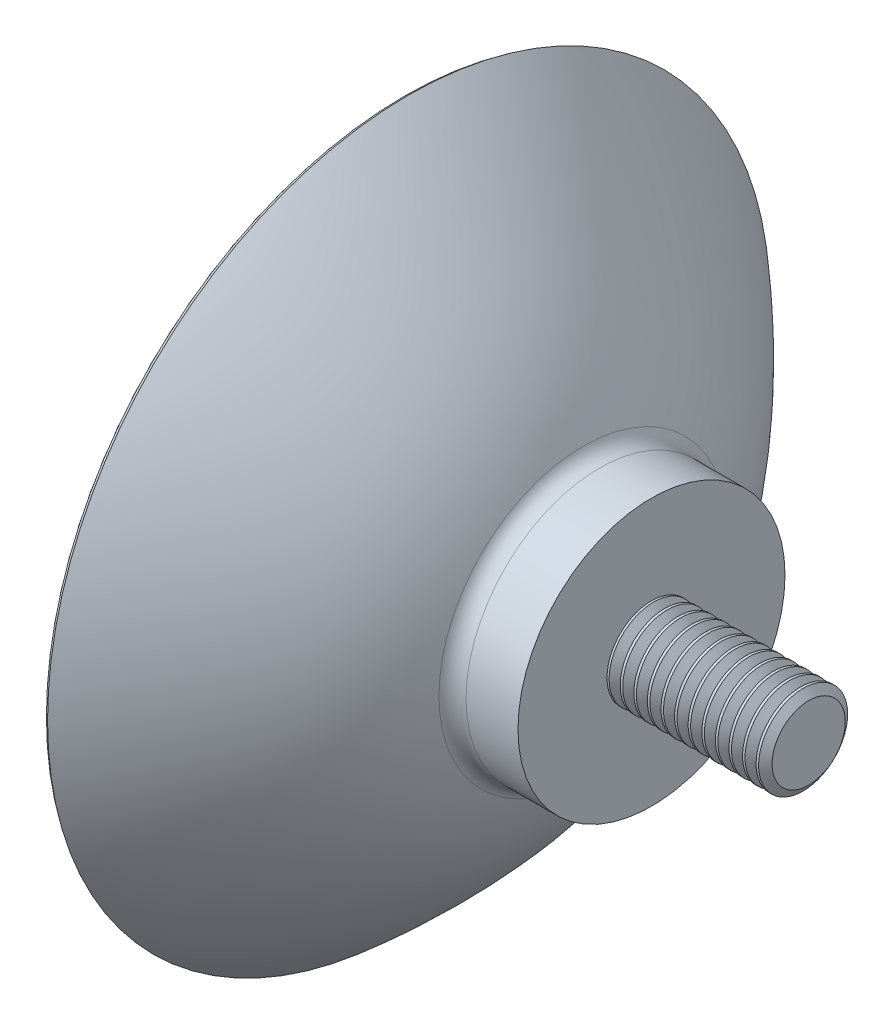
ISO-10303-21;
HEADER;
FILE_DESCRIPTION(('STEP AP214'),'2;1');
FILE_NAME('part.step','',(''),(''),'','','');
FILE_SCHEMA(('AUTOMOTIVE_DESIGN { 1 0 10303 214 1 1 1 1 }'));
ENDSEC;
DATA;
#1=APPLICATION_CONTEXT('core data for automotive mechanical design processes');
#2=APPLICATION_PROTOCOL_DEFINITION('international standard','automotive_design',2000,#1);
#3=PRODUCT_CONTEXT('',#1,'mechanical');
#4=PRODUCT('Part','Part','',(#3));
#5=PRODUCT_RELATED_PRODUCT_CATEGORY('part','',(#4));
#6=PRODUCT_DEFINITION_FORMATION('','',#4);
#7=PRODUCT_DEFINITION_CONTEXT('part definition',#1,'design');
#8=PRODUCT_DEFINITION('design','',#6,#7);
#9=PRODUCT_DEFINITION_SHAPE('','',#8);
#10=(LENGTH_UNIT() NAMED_UNIT(*) SI_UNIT(.MILLI.,.METRE.));
#11=(NAMED_UNIT(*) PLANE_ANGLE_UNIT() SI_UNIT($,.RADIAN.));
#12=(NAMED_UNIT(*) SI_UNIT($,.STERADIAN.) SOLID_ANGLE_UNIT());
#13=UNCERTAINTY_MEASURE_WITH_UNIT(LENGTH_MEASURE(1.E-05),#10,'distance_accuracy_value','');
#14=(GEOMETRIC_REPRESENTATION_CONTEXT(3) GLOBAL_UNCERTAINTY_ASSIGNED_CONTEXT((#13)) GLOBAL_UNIT_ASSIGNED_CONTEXT((#10,
#11,#12)) REPRESENTATION_CONTEXT('',''));
#15=CARTESIAN_POINT('',(0.,0.,0.));
#16=DIRECTION('',(0.,0.,1.));
#17=DIRECTION('',(1.,0.,0.));
#18=AXIS2_PLACEMENT_3D('',#15,#16,#17);
#19=CARTESIAN_POINT('',(4.86987264257723,0.,0.));
#20=DIRECTION('',(1.,0.,0.));
#21=DIRECTION('',(0.,0.,-1.));
#22=AXIS2_PLACEMENT_3D('',#19,#20,#21);
#23=PLANE('',#22);
#24=CARTESIAN_POINT('',(4.86987264257723,0.,0.));
#25=DIRECTION('',(1.,0.,0.));
#26=DIRECTION('',(0.,0.,-1.));
#27=AXIS2_PLACEMENT_3D('',#24,#25,#26);
#28=CIRCLE('',#27,7.5);
#29=CARTESIAN_POINT('',(4.86987264257723,0.,-7.5));
#30=VERTEX_POINT('',#29);
#31=EDGE_CURVE('E66',#30,#30,#28,.T.);
#32=ORIENTED_EDGE('',*,*,#31,.T.);
#33=EDGE_LOOP('',(#32));
#34=FACE_BOUND('',#33,.T.);
#35=ADVANCED_FACE('F54',(#34),#23,.T.);
#36=CARTESIAN_POINT('',(0.,0.,0.));
#37=DIRECTION('',(1.,0.,0.));
#38=DIRECTION('',(0.,0.,-1.));
#39=AXIS2_PLACEMENT_3D('',#36,#37,#38);
#40=CYLINDRICAL_SURFACE('',#39,7.5);
#41=CARTESIAN_POINT('',(1.95149529564312,0.,0.));
#42=DIRECTION('',(1.,0.,0.));
#43=DIRECTION('',(0.,0.,-1.));
#44=AXIS2_PLACEMENT_3D('',#41,#42,#43);
#45=CIRCLE('',#44,7.5);
#46=CARTESIAN_POINT('',(1.95149529564312,0.,-7.5));
#47=VERTEX_POINT('',#46);
#48=EDGE_CURVE('E70',#47,#47,#45,.T.);
#49=ORIENTED_EDGE('',*,*,#48,.T.);
#50=EDGE_LOOP('',(#49));
#51=FACE_BOUND('',#50,.T.);
#52=ORIENTED_EDGE('',*,*,#31,.F.);
#53=EDGE_LOOP('',(#52));
#54=FACE_BOUND('',#53,.T.);
#55=ADVANCED_FACE('F120',(#51,#54),#40,.T.);
#56=CARTESIAN_POINT('',(1.95149529564312,0.,0.));
#57=DIRECTION('',(1.,0.,0.));
#58=DIRECTION('',(0.,0.,-1.));
#59=AXIS2_PLACEMENT_3D('',#56,#57,#58);
#60=TOROIDAL_SURFACE('',#59,8.5,1.);
#61=CARTESIAN_POINT('',(1.03361690387741,0.,0.));
#62=DIRECTION('',(1.,0.,0.));
#63=DIRECTION('',(0.,0.,-1.));
#64=AXIS2_PLACEMENT_3D('',#61,#62,#63);
#65=CIRCLE('',#64,8.10313823826227);
#66=CARTESIAN_POINT('',(1.03361690387741,0.,-8.10313823826227));
#67=VERTEX_POINT('',#66);
#68=EDGE_CURVE('E75',#67,#67,#65,.T.);
#69=ORIENTED_EDGE('',*,*,#68,.T.);
#70=EDGE_LOOP('',(#69));
#71=FACE_BOUND('',#70,.T.);
#72=ORIENTED_EDGE('',*,*,#48,.F.);
#73=EDGE_LOOP('',(#72));
#74=FACE_BOUND('',#73,.T.);
#75=ADVANCED_FACE('F116',(#71,#74),#60,.F.);
#76=CARTESIAN_POINT('',(1.03361690387741,8.10313823826227,0.));
#77=CARTESIAN_POINT('',(0.351426829557951,9.68093582085902,0.));
#78=CARTESIAN_POINT('',(-1.33251546120204,12.9473076999795,0.));
#79=CARTESIAN_POINT('',(-6.40063368934317,18.2862570991169,0.));
#80=CARTESIAN_POINT('',(-8.76842732654036,20.2897798828361,0.));
#81=B_SPLINE_CURVE_WITH_KNOTS('',3,(#76,#77,#78,#79,#80),.UNSPECIFIED.,.F.,.F.,(4,1,4),(0.,
0.468750567020365,0.937501134040731),.UNSPECIFIED.);
#82=CARTESIAN_POINT('',(0.,0.,0.));
#83=DIRECTION('',(1.,0.,0.));
#84=AXIS1_PLACEMENT('',#82,#83);
#85=SURFACE_OF_REVOLUTION('',#81,#84);
#86=CARTESIAN_POINT('',(-8.76842732654036,0.,0.));
#87=DIRECTION('',(1.,0.,0.));
#88=DIRECTION('',(0.,0.,-1.));
#89=AXIS2_PLACEMENT_3D('',#86,#87,#88);
#90=CIRCLE('',#89,20.2897798828361);
#91=CARTESIAN_POINT('',(-8.76842732654036,0.,-20.2897798828361));
#92=VERTEX_POINT('',#91);
#93=EDGE_CURVE('E78',#92,#92,#90,.T.);
#94=ORIENTED_EDGE('',*,*,#93,.T.);
#95=EDGE_LOOP('',(#94));
#96=FACE_BOUND('',#95,.T.);
#97=ORIENTED_EDGE('',*,*,#68,.F.);
#98=EDGE_LOOP('',(#97));
#99=FACE_BOUND('',#98,.T.);
#100=ADVANCED_FACE('F113',(#96,#99),#85,.F.);
#101=CARTESIAN_POINT('',(-8.76842732654036,0.,0.));
#102=DIRECTION('',(1.,0.,0.));
#103=DIRECTION('',(0.,0.,-1.));
#104=AXIS2_PLACEMENT_3D('',#101,#102,#103);
#105=CONICAL_SURFACE('',#104,20.2897798828361,0.618188375443649);
#106=CARTESIAN_POINT('',(-8.98356667147019,0.,0.));
#107=DIRECTION('',(-1.,0.,0.));
#108=DIRECTION('',(0.,0.,1.));
#109=AXIS2_PLACEMENT_3D('',#106,#107,#108);
#110=CIRCLE('',#109,20.1367776023849);
#111=CARTESIAN_POINT('',(-8.98356667147019,0.,20.1367776023849));
#112=VERTEX_POINT('',#111);
#113=EDGE_CURVE('E62',#112,#112,#110,.F.);
#114=ORIENTED_EDGE('',*,*,#113,.T.);
#115=EDGE_LOOP('',(#114));
#116=FACE_BOUND('',#115,.T.);
#117=ORIENTED_EDGE('',*,*,#93,.F.);
#118=EDGE_LOOP('',(#117));
#119=FACE_BOUND('',#118,.T.);
#120=ADVANCED_FACE('F109',(#116,#119),#105,.T.);
#121=CARTESIAN_POINT('',(-9.17589219558246,20.,0.));
#122=CARTESIAN_POINT('',(-3.56753027426235,14.3714346457542,0.));
#123=CARTESIAN_POINT('',(-2.21764157940763,12.305894249129,0.));
#124=CARTESIAN_POINT('',(-0.212947729553599,7.69162995522039,0.));
#125=B_SPLINE_CURVE_WITH_KNOTS('',3,(#121,#122,#123,#124),.UNSPECIFIED.,.F.,.F.,(4,4),(0.,
0.986314209542977),.UNSPECIFIED.);
#126=CARTESIAN_POINT('',(0.,0.,0.));
#127=DIRECTION('',(1.,0.,0.));
#128=AXIS1_PLACEMENT('',#126,#127);
#129=SURFACE_OF_REVOLUTION('',#125,#128);
#130=CARTESIAN_POINT('',(-9.00951159244705,0.,0.));
#131=DIRECTION('',(1.,0.,0.));
#132=DIRECTION('',(0.,0.,-1.));
#133=AXIS2_PLACEMENT_3D('',#130,#131,#132);
#134=CIRCLE('',#133,19.8328071617648);
#135=CARTESIAN_POINT('',(-9.00951159244705,0.,-19.8328071617648));
#136=VERTEX_POINT('',#135);
#137=EDGE_CURVE('E11',#136,#136,#134,.F.);
#138=ORIENTED_EDGE('',*,*,#137,.T.);
#139=EDGE_LOOP('',(#138));
#140=FACE_BOUND('',#139,.T.);
#141=CARTESIAN_POINT('',(-0.212947729553599,0.,0.));
#142=DIRECTION('',(1.,0.,0.));
#143=DIRECTION('',(0.,0.,-1.));
#144=AXIS2_PLACEMENT_3D('',#141,#142,#143);
#145=CIRCLE('',#144,7.6916299552204);
#146=CARTESIAN_POINT('',(-0.212947729553599,0.,-7.6916299552204));
#147=VERTEX_POINT('',#146);
#148=EDGE_CURVE('E81',#147,#147,#145,.T.);
#149=ORIENTED_EDGE('',*,*,#148,.T.);
#150=EDGE_LOOP('',(#149));
#151=FACE_BOUND('',#150,.T.);
#152=ADVANCED_FACE('F104',(#140,#151),#129,.F.);
#153=CARTESIAN_POINT('',(-1.13012735742278,0.,0.));
#154=DIRECTION('',(1.,0.,0.));
#155=DIRECTION('',(0.,0.,-1.));
#156=AXIS2_PLACEMENT_3D('',#153,#154,#155);
#157=TOROIDAL_SURFACE('',#156,7.2931559532808,1.);
#158=CARTESIAN_POINT('',(-0.130127357422775,0.,0.));
#159=DIRECTION('',(1.,0.,0.));
#160=DIRECTION('',(0.,0.,-1.));
#161=AXIS2_PLACEMENT_3D('',#158,#159,#160);
#162=CIRCLE('',#161,7.2931559532808);
#163=CARTESIAN_POINT('',(-0.130127357422775,0.,-7.2931559532808));
#164=VERTEX_POINT('',#163);
#165=EDGE_CURVE('E84',#164,#164,#162,.T.);
#166=ORIENTED_EDGE('',*,*,#165,.T.);
#167=EDGE_LOOP('',(#166));
#168=FACE_BOUND('',#167,.T.);
#169=ORIENTED_EDGE('',*,*,#148,.F.);
#170=EDGE_LOOP('',(#169));
#171=FACE_BOUND('',#170,.T.);
#172=ADVANCED_FACE('F108',(#168,#171),#157,.F.);
#173=CARTESIAN_POINT('',(-0.130127357422775,0.,0.));
#174=DIRECTION('',(-1.,0.,0.));
#175=DIRECTION('',(0.,0.,1.));
#176=AXIS2_PLACEMENT_3D('',#173,#174,#175);
#177=PLANE('',#176);
#178=ORIENTED_EDGE('',*,*,#165,.F.);
#179=EDGE_LOOP('',(#178));
#180=FACE_BOUND('',#179,.T.);
#181=ADVANCED_FACE('F158',(#180),#177,.T.);
#182=CARTESIAN_POINT('',(-8.86765471833575,0.,0.));
#183=DIRECTION('',(-1.,0.,0.));
#184=DIRECTION('',(0.,0.,1.));
#185=AXIS2_PLACEMENT_3D('',#182,#183,#184);
#186=TOROIDAL_SURFACE('',#185,19.973791654768,0.2);
#187=ORIENTED_EDGE('',*,*,#137,.F.);
#188=EDGE_LOOP('',(#187));
#189=FACE_BOUND('',#188,.T.);
#190=ORIENTED_EDGE('',*,*,#113,.F.);
#191=EDGE_LOOP('',(#190));
#192=FACE_BOUND('',#191,.T.);
#193=ADVANCED_FACE('F56',(#189,#192),#186,.T.);
#194=CLOSED_SHELL('',(#35,#55,#75,#100,#120,#152,#172,#181,#193));
#195=CARTESIAN_POINT('',(1.56280340520808,0.,0.));
#196=DIRECTION('',(1.,0.,0.));
#197=DIRECTION('',(0.,0.,-1.));
#198=AXIS2_PLACEMENT_3D('',#195,#196,#197);
#199=PLANE('',#198);
#200=CARTESIAN_POINT('',(1.56280340520808,0.,0.));
#201=DIRECTION('',(1.,0.,0.));
#202=DIRECTION('',(0.,0.,-1.));
#203=AXIS2_PLACEMENT_3D('',#200,#201,#202);
#204=CIRCLE('',#203,4.75);
#205=CARTESIAN_POINT('',(1.56280340520808,0.,-4.75));
#206=VERTEX_POINT('',#205);
#207=EDGE_CURVE('E87',#206,#206,#204,.T.);
#208=ORIENTED_EDGE('',*,*,#207,.T.);
#209=EDGE_LOOP('',(#208));
#210=FACE_BOUND('',#209,.T.);
#211=ADVANCED_FACE('F174',(#210),#199,.T.);
#212=CARTESIAN_POINT('',(0.,0.,0.));
#213=DIRECTION('',(1.,0.,0.));
#214=DIRECTION('',(0.,0.,-1.));
#215=AXIS2_PLACEMENT_3D('',#212,#213,#214);
#216=CYLINDRICAL_SURFACE('',#215,4.75);
#217=CARTESIAN_POINT('',(3.74298757229953,0.,0.));
#218=DIRECTION('',(1.,0.,0.));
#219=DIRECTION('',(0.,0.,-1.));
#220=AXIS2_PLACEMENT_3D('',#217,#218,#219);
#221=CIRCLE('',#220,4.75);
#222=CARTESIAN_POINT('',(3.74298757229953,0.,-4.75));
#223=VERTEX_POINT('',#222);
#224=EDGE_CURVE('E90',#223,#223,#221,.T.);
#225=ORIENTED_EDGE('',*,*,#224,.T.);
#226=EDGE_LOOP('',(#225));
#227=FACE_BOUND('',#226,.T.);
#228=ORIENTED_EDGE('',*,*,#207,.F.);
#229=EDGE_LOOP('',(#228));
#230=FACE_BOUND('',#229,.T.);
#231=ADVANCED_FACE('F177',(#227,#230),#216,.F.);
#232=CARTESIAN_POINT('',(3.74298757229953,0.,0.));
#233=DIRECTION('',(-1.,0.,0.));
#234=DIRECTION('',(0.,0.,1.));
#235=AXIS2_PLACEMENT_3D('',#232,#233,#234);
#236=PLANE('',#235);
#237=ORIENTED_EDGE('',*,*,#224,.F.);
#238=EDGE_LOOP('',(#237));
#239=FACE_BOUND('',#238,.T.);
#240=ADVANCED_FACE('F186',(#239),#236,.T.);
#241=CLOSED_SHELL('',(#211,#231,#240));
#242=ORIENTED_CLOSED_SHELL('',*,#241,.T.);
#243=BREP_WITH_VOIDS('B2',#194,(#242));
#244=CARTESIAN_POINT('',(-25.4,0.,0.));
#245=DIRECTION('',(-1.,0.,0.));
#246=DIRECTION('',(0.,0.,1.));
#247=AXIS2_PLACEMENT_3D('',#244,#245,#246);
#248=CYLINDRICAL_SURFACE('',#247,4.75);
#249=CARTESIAN_POINT('',(1.56280340520808,0.,0.));
#250=DIRECTION('',(1.,0.,0.));
#251=DIRECTION('',(0.,0.,-1.));
#252=AXIS2_PLACEMENT_3D('',#249,#250,#251);
#253=CIRCLE('',#252,4.75);
#254=CARTESIAN_POINT('',(1.56280340520808,0.,-4.75));
#255=VERTEX_POINT('',#254);
#256=EDGE_CURVE('E686',#255,#255,#253,.F.);
#257=ORIENTED_EDGE('',*,*,#256,.F.);
#258=EDGE_LOOP('',(#257));
#259=FACE_BOUND('',#258,.T.);
#260=CARTESIAN_POINT('',(3.7,0.,0.));
#261=DIRECTION('',(-1.,0.,0.));
#262=DIRECTION('',(0.,0.,1.));
#263=AXIS2_PLACEMENT_3D('',#260,#261,#262);
#264=CIRCLE('',#263,4.75);
#265=CARTESIAN_POINT('',(3.7,0.,4.75));
#266=VERTEX_POINT('',#265);
#267=EDGE_CURVE('E255',#266,#266,#264,.T.);
#268=ORIENTED_EDGE('',*,*,#267,.T.);
#269=EDGE_LOOP('',(#268));
#270=FACE_BOUND('',#269,.T.);
#271=ADVANCED_FACE('F244',(#259,#270),#248,.T.);
#272=CARTESIAN_POINT('',(3.7,2.5,0.));
#273=DIRECTION('',(-1.,0.,0.));
#274=DIRECTION('',(0.,0.,1.));
#275=AXIS2_PLACEMENT_3D('',#272,#273,#274);
#276=PLANE('',#275);
#277=CARTESIAN_POINT('',(3.7,0.,0.));
#278=DIRECTION('',(-1.,0.,0.));
#279=DIRECTION('',(0.,0.,1.));
#280=AXIS2_PLACEMENT_3D('',#277,#278,#279);
#281=CIRCLE('',#280,2.7);
#282=CARTESIAN_POINT('',(3.7,0.,2.7));
#283=VERTEX_POINT('',#282);
#284=EDGE_CURVE('E52',#283,#283,#281,.T.);
#285=ORIENTED_EDGE('',*,*,#284,.T.);
#286=EDGE_LOOP('',(#285));
#287=FACE_BOUND('',#286,.T.);
#288=ORIENTED_EDGE('',*,*,#267,.F.);
#289=EDGE_LOOP('',(#288));
#290=FACE_BOUND('',#289,.T.);
#291=ADVANCED_FACE('F530',(#287,#290),#276,.F.);
#292=CARTESIAN_POINT('',(4.98840764549668,0.,0.));
#293=DIRECTION('',(-1.,0.,0.));
#294=DIRECTION('',(0.,0.,1.));
#295=AXIS2_PLACEMENT_3D('',#292,#293,#294);
#296=CYLINDRICAL_SURFACE('',#295,2.5);
#297=CARTESIAN_POINT('',(3.9,0.,0.));
#298=DIRECTION('',(-1.,0.,0.));
#299=DIRECTION('',(0.,0.,1.));
#300=AXIS2_PLACEMENT_3D('',#297,#298,#299);
#301=CIRCLE('',#300,2.5);
#302=CARTESIAN_POINT('',(3.9,0.,2.5));
#303=VERTEX_POINT('',#302);
#304=EDGE_CURVE('E251',#303,#303,#301,.F.);
#305=ORIENTED_EDGE('',*,*,#304,.T.);
#306=EDGE_LOOP('',(#305));
#307=FACE_BOUND('',#306,.T.);
#308=CARTESIAN_POINT('',(4.98840764549668,0.,0.));
#309=DIRECTION('',(1.,0.,0.));
#310=DIRECTION('',(0.,0.,-1.));
#311=AXIS2_PLACEMENT_3D('',#308,#309,#310);
#312=CIRCLE('',#311,2.5);
#313=CARTESIAN_POINT('',(4.98840764549668,0.,-2.5));
#314=VERTEX_POINT('',#313);
#315=EDGE_CURVE('E260',#314,#314,#312,.T.);
#316=ORIENTED_EDGE('',*,*,#315,.F.);
#317=EDGE_LOOP('',(#316));
#318=FACE_BOUND('',#317,.T.);
#319=ADVANCED_FACE('F532',(#307,#318),#296,.T.);
#320=CARTESIAN_POINT('',(4.98840764549668,0.,0.));
#321=DIRECTION('',(-1.,0.,0.));
#322=DIRECTION('',(0.,0.,-1.));
#323=AXIS2_PLACEMENT_3D('',#320,#321,#322);
#324=CONICAL_SURFACE('',#323,2.4999999998869,0.959931088640066);
#325=CARTESIAN_POINT('',(5.2999999998633,0.,0.));
#326=DIRECTION('',(1.,0.,0.));
#327=DIRECTION('',(0.,0.,-1.));
#328=AXIS2_PLACEMENT_3D('',#325,#326,#327);
#329=CIRCLE('',#328,2.05500000004122);
#330=CARTESIAN_POINT('',(5.2999999998633,0.,-2.05500000004122));
#331=VERTEX_POINT('',#330);
#332=EDGE_CURVE('E787',#331,#331,#329,.T.);
#333=ORIENTED_EDGE('',*,*,#332,.F.);
#334=EDGE_LOOP('',(#333));
#335=FACE_BOUND('',#334,.T.);
#336=ORIENTED_EDGE('',*,*,#315,.T.);
#337=EDGE_LOOP('',(#336));
#338=FACE_BOUND('',#337,.T.);
#339=ADVANCED_FACE('F537',(#335,#338),#324,.T.);
#340=CARTESIAN_POINT('',(5.2999999998633,0.,0.));
#341=DIRECTION('',(1.,0.,0.));
#342=DIRECTION('',(0.,0.,-1.));
#343=AXIS2_PLACEMENT_3D('',#340,#341,#342);
#344=CONICAL_SURFACE('',#343,2.05499999974083,0.959931088708716);
#345=CARTESIAN_POINT('',(5.61159235451214,0.,0.));
#346=DIRECTION('',(1.,0.,0.));
#347=DIRECTION('',(0.,0.,-1.));
#348=AXIS2_PLACEMENT_3D('',#345,#346,#347);
#349=CIRCLE('',#348,2.50000000005457);
#350=CARTESIAN_POINT('',(5.61159235451214,0.,-2.50000000005457));
#351=VERTEX_POINT('',#350);
#352=EDGE_CURVE('E785',#351,#351,#349,.T.);
#353=ORIENTED_EDGE('',*,*,#352,.F.);
#354=EDGE_LOOP('',(#353));
#355=FACE_BOUND('',#354,.T.);
#356=ORIENTED_EDGE('',*,*,#332,.T.);
#357=EDGE_LOOP('',(#356));
#358=FACE_BOUND('',#357,.T.);
#359=ADVANCED_FACE('F540',(#355,#358),#344,.T.);
#360=CARTESIAN_POINT('',(5.75204400913304,0.,0.));
#361=DIRECTION('',(-1.,0.,0.));
#362=DIRECTION('',(0.,0.,1.));
#363=AXIS2_PLACEMENT_3D('',#360,#361,#362);
#364=CYLINDRICAL_SURFACE('',#363,2.5);
#365=CARTESIAN_POINT('',(5.75204400913304,0.,0.));
#366=DIRECTION('',(1.,0.,0.));
#367=DIRECTION('',(0.,0.,-1.));
#368=AXIS2_PLACEMENT_3D('',#365,#366,#367);
#369=CIRCLE('',#368,2.5);
#370=CARTESIAN_POINT('',(5.75204400913304,0.,-2.5));
#371=VERTEX_POINT('',#370);
#372=EDGE_CURVE('E782',#371,#371,#369,.T.);
#373=ORIENTED_EDGE('',*,*,#372,.F.);
#374=EDGE_LOOP('',(#373));
#375=FACE_BOUND('',#374,.T.);
#376=ORIENTED_EDGE('',*,*,#352,.T.);
#377=EDGE_LOOP('',(#376));
#378=FACE_BOUND('',#377,.T.);
#379=ADVANCED_FACE('F544',(#375,#378),#364,.T.);
#380=CARTESIAN_POINT('',(5.75204400913304,0.,0.));
#381=DIRECTION('',(-1.,0.,0.));
#382=DIRECTION('',(0.,0.,-1.));
#383=AXIS2_PLACEMENT_3D('',#380,#381,#382);
#384=CONICAL_SURFACE('',#383,2.49999999993787,0.959931088640066);
#385=CARTESIAN_POINT('',(6.06363636353535,0.,0.));
#386=DIRECTION('',(1.,0.,0.));
#387=DIRECTION('',(0.,0.,-1.));
#388=AXIS2_PLACEMENT_3D('',#385,#386,#387);
#389=CIRCLE('',#388,2.05500000004122);
#390=CARTESIAN_POINT('',(6.06363636353535,0.,-2.05500000004122));
#391=VERTEX_POINT('',#390);
#392=EDGE_CURVE('E779',#391,#391,#389,.T.);
#393=ORIENTED_EDGE('',*,*,#392,.F.);
#394=EDGE_LOOP('',(#393));
#395=FACE_BOUND('',#394,.T.);
#396=ORIENTED_EDGE('',*,*,#372,.T.);
#397=EDGE_LOOP('',(#396));
#398=FACE_BOUND('',#397,.T.);
#399=ADVANCED_FACE('F548',(#395,#398),#384,.T.);
#400=CARTESIAN_POINT('',(6.06363636353535,0.,0.));
#401=DIRECTION('',(1.,0.,0.));
#402=DIRECTION('',(0.,0.,-1.));
#403=AXIS2_PLACEMENT_3D('',#400,#401,#402);
#404=CONICAL_SURFACE('',#403,2.05499999982201,0.959931088708716);
#405=CARTESIAN_POINT('',(6.37522871812735,0.,0.));
#406=DIRECTION('',(1.,0.,0.));
#407=DIRECTION('',(0.,0.,-1.));
#408=AXIS2_PLACEMENT_3D('',#405,#406,#407);
#409=CIRCLE('',#408,2.50000000005457);
#410=CARTESIAN_POINT('',(6.37522871812735,0.,-2.50000000005457));
#411=VERTEX_POINT('',#410);
#412=EDGE_CURVE('E776',#411,#411,#409,.T.);
#413=ORIENTED_EDGE('',*,*,#412,.F.);
#414=EDGE_LOOP('',(#413));
#415=FACE_BOUND('',#414,.T.);
#416=ORIENTED_EDGE('',*,*,#392,.T.);
#417=EDGE_LOOP('',(#416));
#418=FACE_BOUND('',#417,.T.);
#419=ADVANCED_FACE('F552',(#415,#418),#404,.T.);
#420=CARTESIAN_POINT('',(6.51568037276941,0.,0.));
#421=DIRECTION('',(-1.,0.,0.));
#422=DIRECTION('',(0.,0.,1.));
#423=AXIS2_PLACEMENT_3D('',#420,#421,#422);
#424=CYLINDRICAL_SURFACE('',#423,2.5);
#425=CARTESIAN_POINT('',(6.51568037276941,0.,0.));
#426=DIRECTION('',(1.,0.,0.));
#427=DIRECTION('',(0.,0.,-1.));
#428=AXIS2_PLACEMENT_3D('',#425,#426,#427);
#429=CIRCLE('',#428,2.5);
#430=CARTESIAN_POINT('',(6.51568037276941,0.,-2.5));
#431=VERTEX_POINT('',#430);
#432=EDGE_CURVE('E773',#431,#431,#429,.T.);
#433=ORIENTED_EDGE('',*,*,#432,.F.);
#434=EDGE_LOOP('',(#433));
#435=FACE_BOUND('',#434,.T.);
#436=ORIENTED_EDGE('',*,*,#412,.T.);
#437=EDGE_LOOP('',(#436));
#438=FACE_BOUND('',#437,.T.);
#439=ADVANCED_FACE('F556',(#435,#438),#424,.T.);
#440=CARTESIAN_POINT('',(6.51568037276941,0.,0.));
#441=DIRECTION('',(-1.,0.,0.));
#442=DIRECTION('',(0.,0.,-1.));
#443=AXIS2_PLACEMENT_3D('',#440,#441,#442);
#444=CONICAL_SURFACE('',#443,2.49999999990764,0.959931088640067);
#445=CARTESIAN_POINT('',(6.82727272715056,0.,0.));
#446=DIRECTION('',(1.,0.,0.));
#447=DIRECTION('',(0.,0.,-1.));
#448=AXIS2_PLACEMENT_3D('',#445,#446,#447);
#449=CIRCLE('',#448,2.05500000004122);
#450=CARTESIAN_POINT('',(6.82727272715056,0.,-2.05500000004122));
#451=VERTEX_POINT('',#450);
#452=EDGE_CURVE('E770',#451,#451,#449,.T.);
#453=ORIENTED_EDGE('',*,*,#452,.F.);
#454=EDGE_LOOP('',(#453));
#455=FACE_BOUND('',#454,.T.);
#456=ORIENTED_EDGE('',*,*,#432,.T.);
#457=EDGE_LOOP('',(#456));
#458=FACE_BOUND('',#457,.T.);
#459=ADVANCED_FACE('F560',(#455,#458),#444,.T.);
#460=CARTESIAN_POINT('',(6.82727272715056,0.,0.));
#461=DIRECTION('',(1.,0.,0.));
#462=DIRECTION('',(0.,0.,-1.));
#463=AXIS2_PLACEMENT_3D('',#460,#461,#462);
#464=CONICAL_SURFACE('',#463,2.05499999974083,0.959931088708716);
#465=CARTESIAN_POINT('',(7.13886508179939,0.,0.));
#466=DIRECTION('',(1.,0.,0.));
#467=DIRECTION('',(0.,0.,-1.));
#468=AXIS2_PLACEMENT_3D('',#465,#466,#467);
#469=CIRCLE('',#468,2.50000000005457);
#470=CARTESIAN_POINT('',(7.13886508179939,0.,-2.50000000005457));
#471=VERTEX_POINT('',#470);
#472=EDGE_CURVE('E767',#471,#471,#469,.T.);
#473=ORIENTED_EDGE('',*,*,#472,.F.);
#474=EDGE_LOOP('',(#473));
#475=FACE_BOUND('',#474,.T.);
#476=ORIENTED_EDGE('',*,*,#452,.T.);
#477=EDGE_LOOP('',(#476));
#478=FACE_BOUND('',#477,.T.);
#479=ADVANCED_FACE('F564',(#475,#478),#464,.T.);
#480=CARTESIAN_POINT('',(7.27931673640577,0.,0.));
#481=DIRECTION('',(-1.,0.,0.));
#482=DIRECTION('',(0.,0.,1.));
#483=AXIS2_PLACEMENT_3D('',#480,#481,#482);
#484=CYLINDRICAL_SURFACE('',#483,2.5);
#485=CARTESIAN_POINT('',(7.27931673640577,0.,0.));
#486=DIRECTION('',(1.,0.,0.));
#487=DIRECTION('',(0.,0.,-1.));
#488=AXIS2_PLACEMENT_3D('',#485,#486,#487);
#489=CIRCLE('',#488,2.5);
#490=CARTESIAN_POINT('',(7.27931673640577,0.,-2.5));
#491=VERTEX_POINT('',#490);
#492=EDGE_CURVE('E764',#491,#491,#489,.T.);
#493=ORIENTED_EDGE('',*,*,#492,.F.);
#494=EDGE_LOOP('',(#493));
#495=FACE_BOUND('',#494,.T.);
#496=ORIENTED_EDGE('',*,*,#472,.T.);
#497=EDGE_LOOP('',(#496));
#498=FACE_BOUND('',#497,.T.);
#499=ADVANCED_FACE('F568',(#495,#498),#484,.T.);
#500=CARTESIAN_POINT('',(7.27931673640577,0.,0.));
#501=DIRECTION('',(-1.,0.,0.));
#502=DIRECTION('',(0.,0.,-1.));
#503=AXIS2_PLACEMENT_3D('',#500,#501,#502);
#504=CONICAL_SURFACE('',#503,2.49999999999112,0.959931088562979);
#505=CARTESIAN_POINT('',(7.59090909093629,0.,0.));
#506=DIRECTION('',(1.,0.,0.));
#507=DIRECTION('',(0.,0.,-1.));
#508=AXIS2_PLACEMENT_3D('',#505,#506,#507);
#509=CIRCLE('',#508,2.05499999998438);
#510=CARTESIAN_POINT('',(7.59090909093629,0.,-2.05499999998438));
#511=VERTEX_POINT('',#510);
#512=EDGE_CURVE('E761',#511,#511,#509,.T.);
#513=ORIENTED_EDGE('',*,*,#512,.F.);
#514=EDGE_LOOP('',(#513));
#515=FACE_BOUND('',#514,.T.);
#516=ORIENTED_EDGE('',*,*,#492,.T.);
#517=EDGE_LOOP('',(#516));
#518=FACE_BOUND('',#517,.T.);
#519=ADVANCED_FACE('F572',(#515,#518),#504,.T.);
#520=CARTESIAN_POINT('',(7.59090909093629,0.,0.));
#521=DIRECTION('',(1.,0.,0.));
#522=DIRECTION('',(0.,0.,-1.));
#523=AXIS2_PLACEMENT_3D('',#520,#521,#522);
#524=CONICAL_SURFACE('',#523,2.05499999998437,0.959931088708716);
#525=CARTESIAN_POINT('',(7.9025014454146,0.,0.));
#526=DIRECTION('',(1.,0.,0.));
#527=DIRECTION('',(0.,0.,-1.));
#528=AXIS2_PLACEMENT_3D('',#525,#526,#527);
#529=CIRCLE('',#528,2.50000000005457);
#530=CARTESIAN_POINT('',(7.9025014454146,0.,-2.50000000005457));
#531=VERTEX_POINT('',#530);
#532=EDGE_CURVE('E758',#531,#531,#529,.T.);
#533=ORIENTED_EDGE('',*,*,#532,.F.);
#534=EDGE_LOOP('',(#533));
#535=FACE_BOUND('',#534,.T.);
#536=ORIENTED_EDGE('',*,*,#512,.T.);
#537=EDGE_LOOP('',(#536));
#538=FACE_BOUND('',#537,.T.);
#539=ADVANCED_FACE('F576',(#535,#538),#524,.T.);
#540=CARTESIAN_POINT('',(8.04295310004213,0.,0.));
#541=DIRECTION('',(-1.,0.,0.));
#542=DIRECTION('',(0.,0.,1.));
#543=AXIS2_PLACEMENT_3D('',#540,#541,#542);
#544=CYLINDRICAL_SURFACE('',#543,2.5);
#545=CARTESIAN_POINT('',(8.04295310004213,0.,0.));
#546=DIRECTION('',(1.,0.,0.));
#547=DIRECTION('',(0.,0.,-1.));
#548=AXIS2_PLACEMENT_3D('',#545,#546,#547);
#549=CIRCLE('',#548,2.5);
#550=CARTESIAN_POINT('',(8.04295310004213,0.,-2.5));
#551=VERTEX_POINT('',#550);
#552=EDGE_CURVE('E755',#551,#551,#549,.T.);
#553=ORIENTED_EDGE('',*,*,#552,.F.);
#554=EDGE_LOOP('',(#553));
#555=FACE_BOUND('',#554,.T.);
#556=ORIENTED_EDGE('',*,*,#532,.T.);
#557=EDGE_LOOP('',(#556));
#558=FACE_BOUND('',#557,.T.);
#559=ADVANCED_FACE('F580',(#555,#558),#544,.T.);
#560=CARTESIAN_POINT('',(8.04295310004213,0.,0.));
#561=DIRECTION('',(-1.,0.,0.));
#562=DIRECTION('',(0.,0.,-1.));
#563=AXIS2_PLACEMENT_3D('',#560,#561,#562);
#564=CONICAL_SURFACE('',#563,2.4999999999284,0.959931088640068);
#565=CARTESIAN_POINT('',(8.35454545443781,0.,0.));
#566=DIRECTION('',(1.,0.,0.));
#567=DIRECTION('',(0.,0.,-1.));
#568=AXIS2_PLACEMENT_3D('',#565,#566,#567);
#569=CIRCLE('',#568,2.05500000004122);
#570=CARTESIAN_POINT('',(8.35454545443781,0.,-2.05500000004122));
#571=VERTEX_POINT('',#570);
#572=EDGE_CURVE('E752',#571,#571,#569,.T.);
#573=ORIENTED_EDGE('',*,*,#572,.F.);
#574=EDGE_LOOP('',(#573));
#575=FACE_BOUND('',#574,.T.);
#576=ORIENTED_EDGE('',*,*,#552,.T.);
#577=EDGE_LOOP('',(#576));
#578=FACE_BOUND('',#577,.T.);
#579=ADVANCED_FACE('F584',(#575,#578),#564,.T.);
#580=CARTESIAN_POINT('',(8.35454545443781,0.,0.));
#581=DIRECTION('',(1.,0.,0.));
#582=DIRECTION('',(0.,0.,-1.));
#583=AXIS2_PLACEMENT_3D('',#580,#581,#582);
#584=CONICAL_SURFACE('',#583,2.05499999982201,0.959931088708716);
#585=CARTESIAN_POINT('',(8.66613780902981,0.,0.));
#586=DIRECTION('',(1.,0.,0.));
#587=DIRECTION('',(0.,0.,-1.));
#588=AXIS2_PLACEMENT_3D('',#585,#586,#587);
#589=CIRCLE('',#588,2.50000000005457);
#590=CARTESIAN_POINT('',(8.66613780902981,0.,-2.50000000005457));
#591=VERTEX_POINT('',#590);
#592=EDGE_CURVE('E749',#591,#591,#589,.T.);
#593=ORIENTED_EDGE('',*,*,#592,.F.);
#594=EDGE_LOOP('',(#593));
#595=FACE_BOUND('',#594,.T.);
#596=ORIENTED_EDGE('',*,*,#572,.T.);
#597=EDGE_LOOP('',(#596));
#598=FACE_BOUND('',#597,.T.);
#599=ADVANCED_FACE('F588',(#595,#598),#584,.T.);
#600=CARTESIAN_POINT('',(8.8065894636785,0.,0.));
#601=DIRECTION('',(-1.,0.,0.));
#602=DIRECTION('',(0.,0.,1.));
#603=AXIS2_PLACEMENT_3D('',#600,#601,#602);
#604=CYLINDRICAL_SURFACE('',#603,2.5);
#605=CARTESIAN_POINT('',(8.8065894636785,0.,0.));
#606=DIRECTION('',(1.,0.,0.));
#607=DIRECTION('',(0.,0.,-1.));
#608=AXIS2_PLACEMENT_3D('',#605,#606,#607);
#609=CIRCLE('',#608,2.5);
#610=CARTESIAN_POINT('',(8.8065894636785,0.,-2.5));
#611=VERTEX_POINT('',#610);
#612=EDGE_CURVE('E746',#611,#611,#609,.T.);
#613=ORIENTED_EDGE('',*,*,#612,.F.);
#614=EDGE_LOOP('',(#613));
#615=FACE_BOUND('',#614,.T.);
#616=ORIENTED_EDGE('',*,*,#592,.T.);
#617=EDGE_LOOP('',(#616));
#618=FACE_BOUND('',#617,.T.);
#619=ADVANCED_FACE('F592',(#615,#618),#604,.T.);
#620=CARTESIAN_POINT('',(8.8065894636785,0.,0.));
#621=DIRECTION('',(-1.,0.,0.));
#622=DIRECTION('',(0.,0.,-1.));
#623=AXIS2_PLACEMENT_3D('',#620,#621,#622);
#624=CONICAL_SURFACE('',#623,2.49999999989818,0.959931088640068);
#625=CARTESIAN_POINT('',(9.11818181805302,0.,0.));
#626=DIRECTION('',(1.,0.,0.));
#627=DIRECTION('',(0.,0.,-1.));
#628=AXIS2_PLACEMENT_3D('',#625,#626,#627);
#629=CIRCLE('',#628,2.05500000004122);
#630=CARTESIAN_POINT('',(9.11818181805302,0.,-2.05500000004122));
#631=VERTEX_POINT('',#630);
#632=EDGE_CURVE('E743',#631,#631,#629,.T.);
#633=ORIENTED_EDGE('',*,*,#632,.F.);
#634=EDGE_LOOP('',(#633));
#635=FACE_BOUND('',#634,.T.);
#636=ORIENTED_EDGE('',*,*,#612,.T.);
#637=EDGE_LOOP('',(#636));
#638=FACE_BOUND('',#637,.T.);
#639=ADVANCED_FACE('F596',(#635,#638),#624,.T.);
#640=CARTESIAN_POINT('',(9.11818181805302,0.,0.));
#641=DIRECTION('',(1.,0.,0.));
#642=DIRECTION('',(0.,0.,-1.));
#643=AXIS2_PLACEMENT_3D('',#640,#641,#642);
#644=CONICAL_SURFACE('',#643,2.05499999974083,0.959931088708716);
#645=CARTESIAN_POINT('',(9.42977417270185,0.,0.));
#646=DIRECTION('',(1.,0.,0.));
#647=DIRECTION('',(0.,0.,-1.));
#648=AXIS2_PLACEMENT_3D('',#645,#646,#647);
#649=CIRCLE('',#648,2.50000000005457);
#650=CARTESIAN_POINT('',(9.42977417270185,0.,-2.50000000005457));
#651=VERTEX_POINT('',#650);
#652=EDGE_CURVE('E740',#651,#651,#649,.T.);
#653=ORIENTED_EDGE('',*,*,#652,.F.);
#654=EDGE_LOOP('',(#653));
#655=FACE_BOUND('',#654,.T.);
#656=ORIENTED_EDGE('',*,*,#632,.T.);
#657=EDGE_LOOP('',(#656));
#658=FACE_BOUND('',#657,.T.);
#659=ADVANCED_FACE('F600',(#655,#658),#644,.T.);
#660=CARTESIAN_POINT('',(9.57022582731486,0.,0.));
#661=DIRECTION('',(-1.,0.,0.));
#662=DIRECTION('',(0.,0.,1.));
#663=AXIS2_PLACEMENT_3D('',#660,#661,#662);
#664=CYLINDRICAL_SURFACE('',#663,2.5);
#665=CARTESIAN_POINT('',(9.57022582731486,0.,0.));
#666=DIRECTION('',(1.,0.,0.));
#667=DIRECTION('',(0.,0.,-1.));
#668=AXIS2_PLACEMENT_3D('',#665,#666,#667);
#669=CIRCLE('',#668,2.5);
#670=CARTESIAN_POINT('',(9.57022582731486,0.,-2.5));
#671=VERTEX_POINT('',#670);
#672=EDGE_CURVE('E737',#671,#671,#669,.T.);
#673=ORIENTED_EDGE('',*,*,#672,.F.);
#674=EDGE_LOOP('',(#673));
#675=FACE_BOUND('',#674,.T.);
#676=ORIENTED_EDGE('',*,*,#652,.T.);
#677=EDGE_LOOP('',(#676));
#678=FACE_BOUND('',#677,.T.);
#679=ADVANCED_FACE('F604',(#675,#678),#664,.T.);
#680=CARTESIAN_POINT('',(9.57022582731486,0.,0.));
#681=DIRECTION('',(-1.,0.,0.));
#682=DIRECTION('',(0.,0.,-1.));
#683=AXIS2_PLACEMENT_3D('',#680,#681,#682);
#684=CONICAL_SURFACE('',#683,2.49999999994915,0.959931088640068);
#685=CARTESIAN_POINT('',(9.88181818172507,0.,0.));
#686=DIRECTION('',(1.,0.,0.));
#687=DIRECTION('',(0.,0.,-1.));
#688=AXIS2_PLACEMENT_3D('',#685,#686,#687);
#689=CIRCLE('',#688,2.05500000004122);
#690=CARTESIAN_POINT('',(9.88181818172507,0.,-2.05500000004122));
#691=VERTEX_POINT('',#690);
#692=EDGE_CURVE('E734',#691,#691,#689,.T.);
#693=ORIENTED_EDGE('',*,*,#692,.F.);
#694=EDGE_LOOP('',(#693));
#695=FACE_BOUND('',#694,.T.);
#696=ORIENTED_EDGE('',*,*,#672,.T.);
#697=EDGE_LOOP('',(#696));
#698=FACE_BOUND('',#697,.T.);
#699=ADVANCED_FACE('F608',(#695,#698),#684,.T.);
#700=CARTESIAN_POINT('',(9.88181818172507,0.,0.));
#701=DIRECTION('',(1.,0.,0.));
#702=DIRECTION('',(0.,0.,-1.));
#703=AXIS2_PLACEMENT_3D('',#700,#701,#702);
#704=CONICAL_SURFACE('',#703,2.05499999982201,0.959931088708716);
#705=CARTESIAN_POINT('',(10.1934105363171,0.,0.));
#706=DIRECTION('',(1.,0.,0.));
#707=DIRECTION('',(0.,0.,-1.));
#708=AXIS2_PLACEMENT_3D('',#705,#706,#707);
#709=CIRCLE('',#708,2.50000000005457);
#710=CARTESIAN_POINT('',(10.1934105363171,0.,-2.50000000005457));
#711=VERTEX_POINT('',#710);
#712=EDGE_CURVE('E731',#711,#711,#709,.T.);
#713=ORIENTED_EDGE('',*,*,#712,.F.);
#714=EDGE_LOOP('',(#713));
#715=FACE_BOUND('',#714,.T.);
#716=ORIENTED_EDGE('',*,*,#692,.T.);
#717=EDGE_LOOP('',(#716));
#718=FACE_BOUND('',#717,.T.);
#719=ADVANCED_FACE('F612',(#715,#718),#704,.T.);
#720=CARTESIAN_POINT('',(10.3338621909512,0.,0.));
#721=DIRECTION('',(-1.,0.,0.));
#722=DIRECTION('',(0.,0.,1.));
#723=AXIS2_PLACEMENT_3D('',#720,#721,#722);
#724=CYLINDRICAL_SURFACE('',#723,2.5);
#725=CARTESIAN_POINT('',(10.3338621909512,0.,0.));
#726=DIRECTION('',(1.,0.,0.));
#727=DIRECTION('',(0.,0.,-1.));
#728=AXIS2_PLACEMENT_3D('',#725,#726,#727);
#729=CIRCLE('',#728,2.5);
#730=CARTESIAN_POINT('',(10.3338621909512,0.,-2.5));
#731=VERTEX_POINT('',#730);
#732=EDGE_CURVE('E728',#731,#731,#729,.T.);
#733=ORIENTED_EDGE('',*,*,#732,.F.);
#734=EDGE_LOOP('',(#733));
#735=FACE_BOUND('',#734,.T.);
#736=ORIENTED_EDGE('',*,*,#712,.T.);
#737=EDGE_LOOP('',(#736));
#738=FACE_BOUND('',#737,.T.);
#739=ADVANCED_FACE('F616',(#735,#738),#724,.T.);
#740=CARTESIAN_POINT('',(10.3338621909512,0.,0.));
#741=DIRECTION('',(-1.,0.,0.));
#742=DIRECTION('',(0.,0.,-1.));
#743=AXIS2_PLACEMENT_3D('',#740,#741,#742);
#744=CONICAL_SURFACE('',#743,2.49999999991892,0.959931088640068);
#745=CARTESIAN_POINT('',(10.6454545453403,0.,0.));
#746=DIRECTION('',(1.,0.,0.));
#747=DIRECTION('',(0.,0.,-1.));
#748=AXIS2_PLACEMENT_3D('',#745,#746,#747);
#749=CIRCLE('',#748,2.05500000004122);
#750=CARTESIAN_POINT('',(10.6454545453403,0.,-2.05500000004122));
#751=VERTEX_POINT('',#750);
#752=EDGE_CURVE('E725',#751,#751,#749,.T.);
#753=ORIENTED_EDGE('',*,*,#752,.F.);
#754=EDGE_LOOP('',(#753));
#755=FACE_BOUND('',#754,.T.);
#756=ORIENTED_EDGE('',*,*,#732,.T.);
#757=EDGE_LOOP('',(#756));
#758=FACE_BOUND('',#757,.T.);
#759=ADVANCED_FACE('F620',(#755,#758),#744,.T.);
#760=CARTESIAN_POINT('',(10.6454545453403,0.,0.));
#761=DIRECTION('',(1.,0.,0.));
#762=DIRECTION('',(0.,0.,-1.));
#763=AXIS2_PLACEMENT_3D('',#760,#761,#762);
#764=CONICAL_SURFACE('',#763,2.05499999982201,0.959931088708716);
#765=CARTESIAN_POINT('',(10.9570468999323,0.,0.));
#766=DIRECTION('',(1.,0.,0.));
#767=DIRECTION('',(0.,0.,-1.));
#768=AXIS2_PLACEMENT_3D('',#765,#766,#767);
#769=CIRCLE('',#768,2.50000000005457);
#770=CARTESIAN_POINT('',(10.9570468999323,0.,-2.50000000005457));
#771=VERTEX_POINT('',#770);
#772=EDGE_CURVE('E722',#771,#771,#769,.T.);
#773=ORIENTED_EDGE('',*,*,#772,.F.);
#774=EDGE_LOOP('',(#773));
#775=FACE_BOUND('',#774,.T.);
#776=ORIENTED_EDGE('',*,*,#752,.T.);
#777=EDGE_LOOP('',(#776));
#778=FACE_BOUND('',#777,.T.);
#779=ADVANCED_FACE('F624',(#775,#778),#764,.T.);
#780=CARTESIAN_POINT('',(11.0974985545876,0.,0.));
#781=DIRECTION('',(-1.,0.,0.));
#782=DIRECTION('',(0.,0.,1.));
#783=AXIS2_PLACEMENT_3D('',#780,#781,#782);
#784=CYLINDRICAL_SURFACE('',#783,2.5);
#785=CARTESIAN_POINT('',(11.0974985545876,0.,0.));
#786=DIRECTION('',(1.,0.,0.));
#787=DIRECTION('',(0.,0.,-1.));
#788=AXIS2_PLACEMENT_3D('',#785,#786,#787);
#789=CIRCLE('',#788,2.5);
#790=CARTESIAN_POINT('',(11.0974985545876,0.,-2.5));
#791=VERTEX_POINT('',#790);
#792=EDGE_CURVE('E719',#791,#791,#789,.T.);
#793=ORIENTED_EDGE('',*,*,#792,.F.);
#794=EDGE_LOOP('',(#793));
#795=FACE_BOUND('',#794,.T.);
#796=ORIENTED_EDGE('',*,*,#772,.T.);
#797=EDGE_LOOP('',(#796));
#798=FACE_BOUND('',#797,.T.);
#799=ADVANCED_FACE('F628',(#795,#798),#784,.T.);
#800=CARTESIAN_POINT('',(11.0974985545876,0.,0.));
#801=DIRECTION('',(-1.,0.,0.));
#802=DIRECTION('',(0.,0.,-1.));
#803=AXIS2_PLACEMENT_3D('',#800,#801,#802);
#804=CONICAL_SURFACE('',#803,2.49999999988871,0.959931088640068);
#805=CARTESIAN_POINT('',(11.4090909089555,0.,0.));
#806=DIRECTION('',(1.,0.,0.));
#807=DIRECTION('',(0.,0.,-1.));
#808=AXIS2_PLACEMENT_3D('',#805,#806,#807);
#809=CIRCLE('',#808,2.05500000004122);
#810=CARTESIAN_POINT('',(11.4090909089555,0.,-2.05500000004122));
#811=VERTEX_POINT('',#810);
#812=EDGE_CURVE('E716',#811,#811,#809,.T.);
#813=ORIENTED_EDGE('',*,*,#812,.F.);
#814=EDGE_LOOP('',(#813));
#815=FACE_BOUND('',#814,.T.);
#816=ORIENTED_EDGE('',*,*,#792,.T.);
#817=EDGE_LOOP('',(#816));
#818=FACE_BOUND('',#817,.T.);
#819=ADVANCED_FACE('F632',(#815,#818),#804,.T.);
#820=CARTESIAN_POINT('',(11.4090909089555,0.,0.));
#821=DIRECTION('',(1.,0.,0.));
#822=DIRECTION('',(0.,0.,-1.));
#823=AXIS2_PLACEMENT_3D('',#820,#821,#822);
#824=CONICAL_SURFACE('',#823,2.05499999974083,0.959931088708717);
#825=CARTESIAN_POINT('',(11.7206832636043,0.,0.));
#826=DIRECTION('',(1.,0.,0.));
#827=DIRECTION('',(0.,0.,-1.));
#828=AXIS2_PLACEMENT_3D('',#825,#826,#827);
#829=CIRCLE('',#828,2.50000000005457);
#830=CARTESIAN_POINT('',(11.7206832636043,0.,-2.50000000005457));
#831=VERTEX_POINT('',#830);
#832=EDGE_CURVE('E713',#831,#831,#829,.T.);
#833=ORIENTED_EDGE('',*,*,#832,.F.);
#834=EDGE_LOOP('',(#833));
#835=FACE_BOUND('',#834,.T.);
#836=ORIENTED_EDGE('',*,*,#812,.T.);
#837=EDGE_LOOP('',(#836));
#838=FACE_BOUND('',#837,.T.);
#839=ADVANCED_FACE('F636',(#835,#838),#824,.T.);
#840=CARTESIAN_POINT('',(11.861134918224,0.,0.));
#841=DIRECTION('',(-1.,0.,0.));
#842=DIRECTION('',(0.,0.,1.));
#843=AXIS2_PLACEMENT_3D('',#840,#841,#842);
#844=CYLINDRICAL_SURFACE('',#843,2.5);
#845=CARTESIAN_POINT('',(11.861134918224,0.,0.));
#846=DIRECTION('',(1.,0.,0.));
#847=DIRECTION('',(0.,0.,-1.));
#848=AXIS2_PLACEMENT_3D('',#845,#846,#847);
#849=CIRCLE('',#848,2.5);
#850=CARTESIAN_POINT('',(11.861134918224,0.,-2.5));
#851=VERTEX_POINT('',#850);
#852=EDGE_CURVE('E710',#851,#851,#849,.T.);
#853=ORIENTED_EDGE('',*,*,#852,.F.);
#854=EDGE_LOOP('',(#853));
#855=FACE_BOUND('',#854,.T.);
#856=ORIENTED_EDGE('',*,*,#832,.T.);
#857=EDGE_LOOP('',(#856));
#858=FACE_BOUND('',#857,.T.);
#859=ADVANCED_FACE('F640',(#855,#858),#844,.T.);
#860=CARTESIAN_POINT('',(11.861134918224,0.,0.));
#861=DIRECTION('',(-1.,0.,0.));
#862=DIRECTION('',(0.,0.,-1.));
#863=AXIS2_PLACEMENT_3D('',#860,#861,#862);
#864=CONICAL_SURFACE('',#863,2.49999999993967,0.959931088640067);
#865=CARTESIAN_POINT('',(12.1727272726275,0.,0.));
#866=DIRECTION('',(1.,0.,0.));
#867=DIRECTION('',(0.,0.,-1.));
#868=AXIS2_PLACEMENT_3D('',#865,#866,#867);
#869=CIRCLE('',#868,2.05500000004122);
#870=CARTESIAN_POINT('',(12.1727272726275,0.,-2.05500000004122));
#871=VERTEX_POINT('',#870);
#872=EDGE_CURVE('E707',#871,#871,#869,.T.);
#873=ORIENTED_EDGE('',*,*,#872,.F.);
#874=EDGE_LOOP('',(#873));
#875=FACE_BOUND('',#874,.T.);
#876=ORIENTED_EDGE('',*,*,#852,.T.);
#877=EDGE_LOOP('',(#876));
#878=FACE_BOUND('',#877,.T.);
#879=ADVANCED_FACE('F644',(#875,#878),#864,.T.);
#880=CARTESIAN_POINT('',(12.1727272726275,0.,0.));
#881=DIRECTION('',(1.,0.,0.));
#882=DIRECTION('',(0.,0.,-1.));
#883=AXIS2_PLACEMENT_3D('',#880,#881,#882);
#884=CONICAL_SURFACE('',#883,2.05499999982201,0.959931088708717);
#885=CARTESIAN_POINT('',(12.4843196272195,0.,0.));
#886=DIRECTION('',(1.,0.,0.));
#887=DIRECTION('',(0.,0.,-1.));
#888=AXIS2_PLACEMENT_3D('',#885,#886,#887);
#889=CIRCLE('',#888,2.50000000005457);
#890=CARTESIAN_POINT('',(12.4843196272195,0.,-2.50000000005457));
#891=VERTEX_POINT('',#890);
#892=EDGE_CURVE('E704',#891,#891,#889,.T.);
#893=ORIENTED_EDGE('',*,*,#892,.F.);
#894=EDGE_LOOP('',(#893));
#895=FACE_BOUND('',#894,.T.);
#896=ORIENTED_EDGE('',*,*,#872,.T.);
#897=EDGE_LOOP('',(#896));
#898=FACE_BOUND('',#897,.T.);
#899=ADVANCED_FACE('F648',(#895,#898),#884,.T.);
#900=CARTESIAN_POINT('',(12.6247712818603,0.,0.));
#901=DIRECTION('',(-1.,0.,0.));
#902=DIRECTION('',(0.,0.,1.));
#903=AXIS2_PLACEMENT_3D('',#900,#901,#902);
#904=CYLINDRICAL_SURFACE('',#903,2.5);
#905=CARTESIAN_POINT('',(12.6247712818603,0.,0.));
#906=DIRECTION('',(1.,0.,0.));
#907=DIRECTION('',(0.,0.,-1.));
#908=AXIS2_PLACEMENT_3D('',#905,#906,#907);
#909=CIRCLE('',#908,2.5);
#910=CARTESIAN_POINT('',(12.6247712818603,0.,-2.5));
#911=VERTEX_POINT('',#910);
#912=EDGE_CURVE('E701',#911,#911,#909,.T.);
#913=ORIENTED_EDGE('',*,*,#912,.F.);
#914=EDGE_LOOP('',(#913));
#915=FACE_BOUND('',#914,.T.);
#916=ORIENTED_EDGE('',*,*,#892,.T.);
#917=EDGE_LOOP('',(#916));
#918=FACE_BOUND('',#917,.T.);
#919=ADVANCED_FACE('F652',(#915,#918),#904,.T.);
#920=CARTESIAN_POINT('',(12.6247712818603,0.,0.));
#921=DIRECTION('',(-1.,0.,0.));
#922=DIRECTION('',(0.,0.,-1.));
#923=AXIS2_PLACEMENT_3D('',#920,#921,#922);
#924=CONICAL_SURFACE('',#923,2.49999999990946,0.959931088640067);
#925=CARTESIAN_POINT('',(12.9363636362427,0.,0.));
#926=DIRECTION('',(1.,0.,0.));
#927=DIRECTION('',(0.,0.,-1.));
#928=AXIS2_PLACEMENT_3D('',#925,#926,#927);
#929=CIRCLE('',#928,2.05500000004122);
#930=CARTESIAN_POINT('',(12.9363636362427,0.,-2.05500000004122));
#931=VERTEX_POINT('',#930);
#932=EDGE_CURVE('E698',#931,#931,#929,.T.);
#933=ORIENTED_EDGE('',*,*,#932,.F.);
#934=EDGE_LOOP('',(#933));
#935=FACE_BOUND('',#934,.T.);
#936=ORIENTED_EDGE('',*,*,#912,.T.);
#937=EDGE_LOOP('',(#936));
#938=FACE_BOUND('',#937,.T.);
#939=ADVANCED_FACE('F656',(#935,#938),#924,.T.);
#940=CARTESIAN_POINT('',(12.9363636362427,0.,0.));
#941=DIRECTION('',(1.,0.,0.));
#942=DIRECTION('',(0.,0.,-1.));
#943=AXIS2_PLACEMENT_3D('',#940,#941,#942);
#944=CONICAL_SURFACE('',#943,2.05499999974083,0.959931088708716);
#945=CARTESIAN_POINT('',(13.2479559908916,0.,0.));
#946=DIRECTION('',(1.,0.,0.));
#947=DIRECTION('',(0.,0.,-1.));
#948=AXIS2_PLACEMENT_3D('',#945,#946,#947);
#949=CIRCLE('',#948,2.50000000005457);
#950=CARTESIAN_POINT('',(13.2479559908916,0.,-2.50000000005457));
#951=VERTEX_POINT('',#950);
#952=EDGE_CURVE('E695',#951,#951,#949,.T.);
#953=ORIENTED_EDGE('',*,*,#952,.F.);
#954=EDGE_LOOP('',(#953));
#955=FACE_BOUND('',#954,.T.);
#956=ORIENTED_EDGE('',*,*,#932,.T.);
#957=EDGE_LOOP('',(#956));
#958=FACE_BOUND('',#957,.T.);
#959=ADVANCED_FACE('F660',(#955,#958),#944,.T.);
#960=CARTESIAN_POINT('',(13.3884076454967,0.,0.));
#961=DIRECTION('',(-1.,0.,0.));
#962=DIRECTION('',(0.,0.,1.));
#963=AXIS2_PLACEMENT_3D('',#960,#961,#962);
#964=CYLINDRICAL_SURFACE('',#963,2.5);
#965=CARTESIAN_POINT('',(13.3884076454967,0.,0.));
#966=DIRECTION('',(1.,0.,0.));
#967=DIRECTION('',(0.,0.,-1.));
#968=AXIS2_PLACEMENT_3D('',#965,#966,#967);
#969=CIRCLE('',#968,2.5);
#970=CARTESIAN_POINT('',(13.3884076454967,0.,-2.5));
#971=VERTEX_POINT('',#970);
#972=EDGE_CURVE('E690',#971,#971,#969,.T.);
#973=ORIENTED_EDGE('',*,*,#972,.F.);
#974=EDGE_LOOP('',(#973));
#975=FACE_BOUND('',#974,.T.);
#976=ORIENTED_EDGE('',*,*,#952,.T.);
#977=EDGE_LOOP('',(#976));
#978=FACE_BOUND('',#977,.T.);
#979=ADVANCED_FACE('F664',(#975,#978),#964,.T.);
#980=CARTESIAN_POINT('',(13.3884076454967,0.,0.));
#981=DIRECTION('',(-1.,0.,0.));
#982=DIRECTION('',(0.,0.,-1.));
#983=AXIS2_PLACEMENT_3D('',#980,#981,#982);
#984=CONICAL_SURFACE('',#983,2.49999999987923,0.959931088597299);
#985=CARTESIAN_POINT('',(13.7,0.,0.));
#986=DIRECTION('',(1.,0.,0.));
#987=DIRECTION('',(0.,0.,-1.));
#988=AXIS2_PLACEMENT_3D('',#985,#986,#987);
#989=CIRCLE('',#988,2.05499999987883);
#990=CARTESIAN_POINT('',(13.7,0.,-2.05499999987884));
#991=VERTEX_POINT('',#990);
#992=EDGE_CURVE('E687',#991,#991,#989,.T.);
#993=ORIENTED_EDGE('',*,*,#992,.F.);
#994=EDGE_LOOP('',(#993));
#995=FACE_BOUND('',#994,.T.);
#996=ORIENTED_EDGE('',*,*,#972,.T.);
#997=EDGE_LOOP('',(#996));
#998=FACE_BOUND('',#997,.T.);
#999=ADVANCED_FACE('F668',(#995,#998),#984,.T.);
#1000=CARTESIAN_POINT('',(13.7,0.,0.));
#1001=DIRECTION('',(1.,0.,0.));
#1002=DIRECTION('',(0.,0.,-1.));
#1003=AXIS2_PLACEMENT_3D('',#1000,#1001,#1002);
#1004=PLANE('',#1003);
#1005=ORIENTED_EDGE('',*,*,#992,.T.);
#1006=EDGE_LOOP('',(#1005));
#1007=FACE_BOUND('',#1006,.T.);
#1008=ADVANCED_FACE('F672',(#1007),#1004,.T.);
#1009=CARTESIAN_POINT('',(3.9,0.,0.));
#1010=DIRECTION('',(-1.,0.,0.));
#1011=DIRECTION('',(0.,0.,1.));
#1012=AXIS2_PLACEMENT_3D('',#1009,#1010,#1011);
#1013=TOROIDAL_SURFACE('',#1012,2.7,0.2);
#1014=ORIENTED_EDGE('',*,*,#284,.F.);
#1015=EDGE_LOOP('',(#1014));
#1016=FACE_BOUND('',#1015,.T.);
#1017=ORIENTED_EDGE('',*,*,#304,.F.);
#1018=EDGE_LOOP('',(#1017));
#1019=FACE_BOUND('',#1018,.T.);
#1020=ADVANCED_FACE('F246',(#1016,#1019),#1013,.F.);
#1021=CARTESIAN_POINT('',(1.56280340520808,-5.75560325171766,-4.81820366021289));
#1022=DIRECTION('',(1.,0.,0.));
#1023=DIRECTION('',(0.,0.,-1.));
#1024=AXIS2_PLACEMENT_3D('',#1021,#1022,#1023);
#1025=PLANE('',#1024);
#1026=ORIENTED_EDGE('',*,*,#256,.T.);
#1027=EDGE_LOOP('',(#1026));
#1028=FACE_BOUND('',#1027,.T.);
#1029=ADVANCED_FACE('F677',(#1028),#1025,.F.);
#1030=CLOSED_SHELL('',(#271,#291,#319,#339,#359,#379,#399,#419,#439,#459,#479,#499,#519,#539,
#559,#579,#599,#619,#639,#659,#679,#699,#719,#739,#759,#779,#799,#819,#839,#859,#879,#899,#919,
#939,#959,#979,#999,#1008,#1020,#1029));
#1031=MANIFOLD_SOLID_BREP('B6',#1030);
#1032=ADVANCED_BREP_SHAPE_REPRESENTATION('',(#18,#243,#1031),#14);
#1033=SHAPE_DEFINITION_REPRESENTATION(#9,#1032);
ENDSEC;
END-ISO-10303-21;
